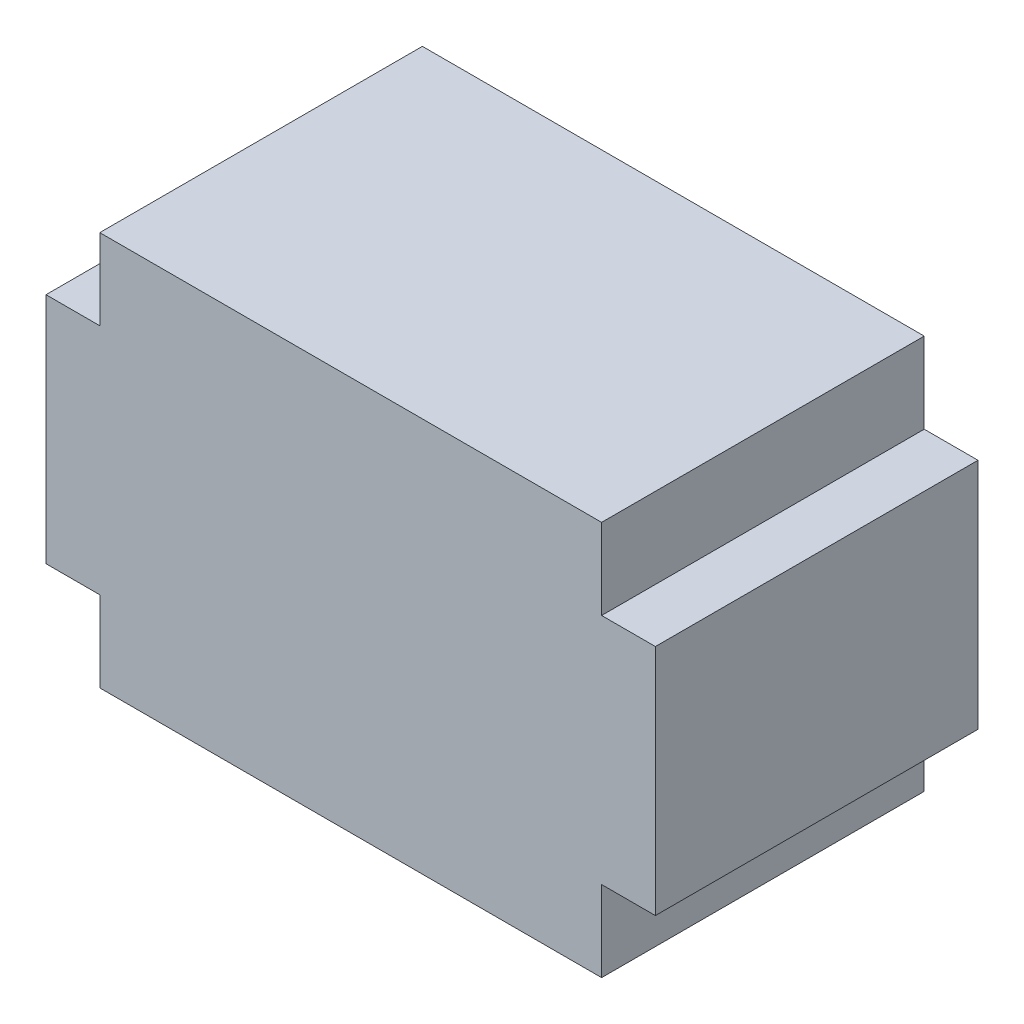
ISO-10303-21;
HEADER;
FILE_DESCRIPTION(('STEP AP214'),'2;1');
FILE_NAME('part.step','',(''),(''),'','','');
FILE_SCHEMA(('AUTOMOTIVE_DESIGN { 1 0 10303 214 1 1 1 1 }'));
ENDSEC;
DATA;
#1=APPLICATION_CONTEXT('core data for automotive mechanical design processes');
#2=APPLICATION_PROTOCOL_DEFINITION('international standard','automotive_design',2000,#1);
#3=PRODUCT_CONTEXT('',#1,'mechanical');
#4=PRODUCT('Part','Part','',(#3));
#5=PRODUCT_RELATED_PRODUCT_CATEGORY('part','',(#4));
#6=PRODUCT_DEFINITION_FORMATION('','',#4);
#7=PRODUCT_DEFINITION_CONTEXT('part definition',#1,'design');
#8=PRODUCT_DEFINITION('design','',#6,#7);
#9=PRODUCT_DEFINITION_SHAPE('','',#8);
#10=(LENGTH_UNIT() NAMED_UNIT(*) SI_UNIT(.MILLI.,.METRE.));
#11=(NAMED_UNIT(*) PLANE_ANGLE_UNIT() SI_UNIT($,.RADIAN.));
#12=(NAMED_UNIT(*) SI_UNIT($,.STERADIAN.) SOLID_ANGLE_UNIT());
#13=UNCERTAINTY_MEASURE_WITH_UNIT(LENGTH_MEASURE(1.E-05),#10,'distance_accuracy_value','');
#14=(GEOMETRIC_REPRESENTATION_CONTEXT(3) GLOBAL_UNCERTAINTY_ASSIGNED_CONTEXT((#13)) GLOBAL_UNIT_ASSIGNED_CONTEXT((#10,
#11,#12)) REPRESENTATION_CONTEXT('',''));
#15=CARTESIAN_POINT('',(0.,0.,0.));
#16=DIRECTION('',(0.,0.,1.));
#17=DIRECTION('',(1.,0.,0.));
#18=AXIS2_PLACEMENT_3D('',#15,#16,#17);
#19=CARTESIAN_POINT('',(1.4,-1.1,1.8));
#20=DIRECTION('',(0.,1.,0.));
#21=DIRECTION('',(0.,0.,1.));
#22=AXIS2_PLACEMENT_3D('',#19,#20,#21);
#23=PLANE('',#22);
#24=DIRECTION('',(1.,0.,0.));
#25=VECTOR('',#24,1.);
#26=CARTESIAN_POINT('',(1.4,-1.1,0.));
#27=LINE('',#26,#25);
#28=CARTESIAN_POINT('',(-1.4,-1.1,0.));
#29=VERTEX_POINT('',#28);
#30=CARTESIAN_POINT('',(1.4,-1.1,0.));
#31=VERTEX_POINT('',#30);
#32=EDGE_CURVE('E98',#29,#31,#27,.T.);
#33=ORIENTED_EDGE('',*,*,#32,.T.);
#34=DIRECTION('',(0.,0.,-1.));
#35=VECTOR('',#34,1.);
#36=CARTESIAN_POINT('',(1.4,-1.1,1.8));
#37=LINE('',#36,#35);
#38=CARTESIAN_POINT('',(1.4,-1.1,1.8));
#39=VERTEX_POINT('',#38);
#40=EDGE_CURVE('E11',#39,#31,#37,.T.);
#41=ORIENTED_EDGE('',*,*,#40,.F.);
#42=DIRECTION('',(1.,0.,0.));
#43=VECTOR('',#42,1.);
#44=CARTESIAN_POINT('',(-1.35,-1.1,1.8));
#45=LINE('',#44,#43);
#46=CARTESIAN_POINT('',(-1.4,-1.1,1.8));
#47=VERTEX_POINT('',#46);
#48=EDGE_CURVE('E104',#47,#39,#45,.T.);
#49=ORIENTED_EDGE('',*,*,#48,.F.);
#50=DIRECTION('',(0.,0.,-1.));
#51=VECTOR('',#50,1.);
#52=CARTESIAN_POINT('',(-1.4,-1.1,1.8));
#53=LINE('',#52,#51);
#54=EDGE_CURVE('E150',#47,#29,#53,.T.);
#55=ORIENTED_EDGE('',*,*,#54,.T.);
#56=EDGE_LOOP('',(#33,#41,#49,#55));
#57=FACE_BOUND('',#56,.T.);
#58=ADVANCED_FACE('F34',(#57),#23,.F.);
#59=CARTESIAN_POINT('',(1.4,-0.65,1.8));
#60=DIRECTION('',(-1.,0.,0.));
#61=DIRECTION('',(0.,0.,1.));
#62=AXIS2_PLACEMENT_3D('',#59,#60,#61);
#63=PLANE('',#62);
#64=DIRECTION('',(0.,1.,0.));
#65=VECTOR('',#64,1.);
#66=CARTESIAN_POINT('',(1.4,-0.65,0.));
#67=LINE('',#66,#65);
#68=CARTESIAN_POINT('',(1.4,-0.65,0.));
#69=VERTEX_POINT('',#68);
#70=EDGE_CURVE('E155',#31,#69,#67,.T.);
#71=ORIENTED_EDGE('',*,*,#70,.T.);
#72=DIRECTION('',(0.,0.,-1.));
#73=VECTOR('',#72,1.);
#74=CARTESIAN_POINT('',(1.4,-0.65,1.8));
#75=LINE('',#74,#73);
#76=CARTESIAN_POINT('',(1.4,-0.65,1.8));
#77=VERTEX_POINT('',#76);
#78=EDGE_CURVE('E42',#77,#69,#75,.T.);
#79=ORIENTED_EDGE('',*,*,#78,.F.);
#80=DIRECTION('',(0.,1.,0.));
#81=VECTOR('',#80,1.);
#82=CARTESIAN_POINT('',(1.4,-0.65,1.8));
#83=LINE('',#82,#81);
#84=EDGE_CURVE('E243',#39,#77,#83,.T.);
#85=ORIENTED_EDGE('',*,*,#84,.F.);
#86=ORIENTED_EDGE('',*,*,#40,.T.);
#87=EDGE_LOOP('',(#71,#79,#85,#86));
#88=FACE_BOUND('',#87,.T.);
#89=ADVANCED_FACE('F246',(#88),#63,.F.);
#90=CARTESIAN_POINT('',(1.7,-0.65,1.8));
#91=DIRECTION('',(0.,1.,0.));
#92=DIRECTION('',(0.,0.,1.));
#93=AXIS2_PLACEMENT_3D('',#90,#91,#92);
#94=PLANE('',#93);
#95=DIRECTION('',(1.,0.,0.));
#96=VECTOR('',#95,1.);
#97=CARTESIAN_POINT('',(1.7,-0.65,0.));
#98=LINE('',#97,#96);
#99=CARTESIAN_POINT('',(1.7,-0.65,0.));
#100=VERTEX_POINT('',#99);
#101=EDGE_CURVE('E157',#69,#100,#98,.T.);
#102=ORIENTED_EDGE('',*,*,#101,.T.);
#103=DIRECTION('',(0.,0.,-1.));
#104=VECTOR('',#103,1.);
#105=CARTESIAN_POINT('',(1.7,-0.65,1.8));
#106=LINE('',#105,#104);
#107=CARTESIAN_POINT('',(1.7,-0.65,1.8));
#108=VERTEX_POINT('',#107);
#109=EDGE_CURVE('E194',#108,#100,#106,.T.);
#110=ORIENTED_EDGE('',*,*,#109,.F.);
#111=DIRECTION('',(1.,0.,0.));
#112=VECTOR('',#111,1.);
#113=CARTESIAN_POINT('',(1.7,-0.65,1.8));
#114=LINE('',#113,#112);
#115=EDGE_CURVE('E203',#77,#108,#114,.T.);
#116=ORIENTED_EDGE('',*,*,#115,.F.);
#117=ORIENTED_EDGE('',*,*,#78,.T.);
#118=EDGE_LOOP('',(#102,#110,#116,#117));
#119=FACE_BOUND('',#118,.T.);
#120=ADVANCED_FACE('F201',(#119),#94,.F.);
#121=CARTESIAN_POINT('',(1.7,0.65,1.8));
#122=DIRECTION('',(-1.,0.,0.));
#123=DIRECTION('',(0.,0.,1.));
#124=AXIS2_PLACEMENT_3D('',#121,#122,#123);
#125=PLANE('',#124);
#126=DIRECTION('',(0.,1.,0.));
#127=VECTOR('',#126,1.);
#128=CARTESIAN_POINT('',(1.7,0.65,0.));
#129=LINE('',#128,#127);
#130=CARTESIAN_POINT('',(1.7,0.65,0.));
#131=VERTEX_POINT('',#130);
#132=EDGE_CURVE('E159',#100,#131,#129,.T.);
#133=ORIENTED_EDGE('',*,*,#132,.T.);
#134=DIRECTION('',(0.,0.,-1.));
#135=VECTOR('',#134,1.);
#136=CARTESIAN_POINT('',(1.7,0.65,1.8));
#137=LINE('',#136,#135);
#138=CARTESIAN_POINT('',(1.7,0.65,1.8));
#139=VERTEX_POINT('',#138);
#140=EDGE_CURVE('E191',#139,#131,#137,.T.);
#141=ORIENTED_EDGE('',*,*,#140,.F.);
#142=DIRECTION('',(0.,1.,0.));
#143=VECTOR('',#142,1.);
#144=CARTESIAN_POINT('',(1.7,0.65,1.8));
#145=LINE('',#144,#143);
#146=EDGE_CURVE('E221',#108,#139,#145,.T.);
#147=ORIENTED_EDGE('',*,*,#146,.F.);
#148=ORIENTED_EDGE('',*,*,#109,.T.);
#149=EDGE_LOOP('',(#133,#141,#147,#148));
#150=FACE_BOUND('',#149,.T.);
#151=ADVANCED_FACE('F212',(#150),#125,.F.);
#152=CARTESIAN_POINT('',(1.4,0.65,1.8));
#153=DIRECTION('',(0.,-1.,0.));
#154=DIRECTION('',(0.,0.,-1.));
#155=AXIS2_PLACEMENT_3D('',#152,#153,#154);
#156=PLANE('',#155);
#157=DIRECTION('',(-1.,0.,0.));
#158=VECTOR('',#157,1.);
#159=CARTESIAN_POINT('',(1.4,0.65,0.));
#160=LINE('',#159,#158);
#161=CARTESIAN_POINT('',(1.4,0.65,0.));
#162=VERTEX_POINT('',#161);
#163=EDGE_CURVE('E161',#131,#162,#160,.T.);
#164=ORIENTED_EDGE('',*,*,#163,.T.);
#165=DIRECTION('',(0.,0.,-1.));
#166=VECTOR('',#165,1.);
#167=CARTESIAN_POINT('',(1.4,0.65,1.8));
#168=LINE('',#167,#166);
#169=CARTESIAN_POINT('',(1.4,0.65,1.8));
#170=VERTEX_POINT('',#169);
#171=EDGE_CURVE('E188',#170,#162,#168,.T.);
#172=ORIENTED_EDGE('',*,*,#171,.F.);
#173=DIRECTION('',(-1.,0.,0.));
#174=VECTOR('',#173,1.);
#175=CARTESIAN_POINT('',(1.4,0.65,1.8));
#176=LINE('',#175,#174);
#177=EDGE_CURVE('E218',#139,#170,#176,.T.);
#178=ORIENTED_EDGE('',*,*,#177,.F.);
#179=ORIENTED_EDGE('',*,*,#140,.T.);
#180=EDGE_LOOP('',(#164,#172,#178,#179));
#181=FACE_BOUND('',#180,.T.);
#182=ADVANCED_FACE('F216',(#181),#156,.F.);
#183=CARTESIAN_POINT('',(1.4,1.1,1.8));
#184=DIRECTION('',(-1.,0.,0.));
#185=DIRECTION('',(0.,0.,1.));
#186=AXIS2_PLACEMENT_3D('',#183,#184,#185);
#187=PLANE('',#186);
#188=DIRECTION('',(0.,1.,0.));
#189=VECTOR('',#188,1.);
#190=CARTESIAN_POINT('',(1.4,1.1,0.));
#191=LINE('',#190,#189);
#192=CARTESIAN_POINT('',(1.4,1.1,0.));
#193=VERTEX_POINT('',#192);
#194=EDGE_CURVE('E163',#162,#193,#191,.T.);
#195=ORIENTED_EDGE('',*,*,#194,.T.);
#196=DIRECTION('',(0.,0.,-1.));
#197=VECTOR('',#196,1.);
#198=CARTESIAN_POINT('',(1.4,1.1,1.8));
#199=LINE('',#198,#197);
#200=CARTESIAN_POINT('',(1.4,1.1,1.8));
#201=VERTEX_POINT('',#200);
#202=EDGE_CURVE('E185',#201,#193,#199,.T.);
#203=ORIENTED_EDGE('',*,*,#202,.F.);
#204=DIRECTION('',(0.,1.,0.));
#205=VECTOR('',#204,1.);
#206=CARTESIAN_POINT('',(1.4,1.1,1.8));
#207=LINE('',#206,#205);
#208=EDGE_CURVE('E220',#170,#201,#207,.T.);
#209=ORIENTED_EDGE('',*,*,#208,.F.);
#210=ORIENTED_EDGE('',*,*,#171,.T.);
#211=EDGE_LOOP('',(#195,#203,#209,#210));
#212=FACE_BOUND('',#211,.T.);
#213=ADVANCED_FACE('F258',(#212),#187,.F.);
#214=CARTESIAN_POINT('',(-1.4,1.1,1.8));
#215=DIRECTION('',(0.,-1.,0.));
#216=DIRECTION('',(0.,0.,-1.));
#217=AXIS2_PLACEMENT_3D('',#214,#215,#216);
#218=PLANE('',#217);
#219=DIRECTION('',(-1.,0.,0.));
#220=VECTOR('',#219,1.);
#221=CARTESIAN_POINT('',(-1.4,1.1,0.));
#222=LINE('',#221,#220);
#223=CARTESIAN_POINT('',(-1.4,1.1,0.));
#224=VERTEX_POINT('',#223);
#225=EDGE_CURVE('E165',#193,#224,#222,.T.);
#226=ORIENTED_EDGE('',*,*,#225,.T.);
#227=DIRECTION('',(0.,0.,-1.));
#228=VECTOR('',#227,1.);
#229=CARTESIAN_POINT('',(-1.4,1.1,1.8));
#230=LINE('',#229,#228);
#231=CARTESIAN_POINT('',(-1.4,1.1,1.8));
#232=VERTEX_POINT('',#231);
#233=EDGE_CURVE('E182',#232,#224,#230,.T.);
#234=ORIENTED_EDGE('',*,*,#233,.F.);
#235=DIRECTION('',(-1.,0.,0.));
#236=VECTOR('',#235,1.);
#237=CARTESIAN_POINT('',(-1.4,1.1,1.8));
#238=LINE('',#237,#236);
#239=EDGE_CURVE('E223',#201,#232,#238,.T.);
#240=ORIENTED_EDGE('',*,*,#239,.F.);
#241=ORIENTED_EDGE('',*,*,#202,.T.);
#242=EDGE_LOOP('',(#226,#234,#240,#241));
#243=FACE_BOUND('',#242,.T.);
#244=ADVANCED_FACE('F261',(#243),#218,.F.);
#245=CARTESIAN_POINT('',(-1.4,0.65,1.8));
#246=DIRECTION('',(1.,0.,0.));
#247=DIRECTION('',(0.,0.,-1.));
#248=AXIS2_PLACEMENT_3D('',#245,#246,#247);
#249=PLANE('',#248);
#250=DIRECTION('',(0.,-1.,0.));
#251=VECTOR('',#250,1.);
#252=CARTESIAN_POINT('',(-1.4,0.65,0.));
#253=LINE('',#252,#251);
#254=CARTESIAN_POINT('',(-1.4,0.65,0.));
#255=VERTEX_POINT('',#254);
#256=EDGE_CURVE('E167',#224,#255,#253,.T.);
#257=ORIENTED_EDGE('',*,*,#256,.T.);
#258=DIRECTION('',(0.,0.,-1.));
#259=VECTOR('',#258,1.);
#260=CARTESIAN_POINT('',(-1.4,0.65,1.8));
#261=LINE('',#260,#259);
#262=CARTESIAN_POINT('',(-1.4,0.65,1.8));
#263=VERTEX_POINT('',#262);
#264=EDGE_CURVE('E179',#263,#255,#261,.T.);
#265=ORIENTED_EDGE('',*,*,#264,.F.);
#266=DIRECTION('',(0.,-1.,0.));
#267=VECTOR('',#266,1.);
#268=CARTESIAN_POINT('',(-1.4,0.65,1.8));
#269=LINE('',#268,#267);
#270=EDGE_CURVE('E229',#232,#263,#269,.T.);
#271=ORIENTED_EDGE('',*,*,#270,.F.);
#272=ORIENTED_EDGE('',*,*,#233,.T.);
#273=EDGE_LOOP('',(#257,#265,#271,#272));
#274=FACE_BOUND('',#273,.T.);
#275=ADVANCED_FACE('F235',(#274),#249,.F.);
#276=CARTESIAN_POINT('',(-1.7,0.65,1.8));
#277=DIRECTION('',(0.,-1.,0.));
#278=DIRECTION('',(0.,0.,-1.));
#279=AXIS2_PLACEMENT_3D('',#276,#277,#278);
#280=PLANE('',#279);
#281=DIRECTION('',(-1.,0.,0.));
#282=VECTOR('',#281,1.);
#283=CARTESIAN_POINT('',(-1.7,0.65,0.));
#284=LINE('',#283,#282);
#285=CARTESIAN_POINT('',(-1.7,0.65,0.));
#286=VERTEX_POINT('',#285);
#287=EDGE_CURVE('E169',#255,#286,#284,.T.);
#288=ORIENTED_EDGE('',*,*,#287,.T.);
#289=DIRECTION('',(0.,0.,-1.));
#290=VECTOR('',#289,1.);
#291=CARTESIAN_POINT('',(-1.7,0.65,1.8));
#292=LINE('',#291,#290);
#293=CARTESIAN_POINT('',(-1.7,0.65,1.8));
#294=VERTEX_POINT('',#293);
#295=EDGE_CURVE('E145',#294,#286,#292,.T.);
#296=ORIENTED_EDGE('',*,*,#295,.F.);
#297=DIRECTION('',(-1.,0.,0.));
#298=VECTOR('',#297,1.);
#299=CARTESIAN_POINT('',(-1.7,0.65,1.8));
#300=LINE('',#299,#298);
#301=EDGE_CURVE('E136',#263,#294,#300,.T.);
#302=ORIENTED_EDGE('',*,*,#301,.F.);
#303=ORIENTED_EDGE('',*,*,#264,.T.);
#304=EDGE_LOOP('',(#288,#296,#302,#303));
#305=FACE_BOUND('',#304,.T.);
#306=ADVANCED_FACE('F239',(#305),#280,.F.);
#307=CARTESIAN_POINT('',(-1.7,-0.65,1.8));
#308=DIRECTION('',(1.,0.,0.));
#309=DIRECTION('',(0.,0.,-1.));
#310=AXIS2_PLACEMENT_3D('',#307,#308,#309);
#311=PLANE('',#310);
#312=DIRECTION('',(0.,-1.,0.));
#313=VECTOR('',#312,1.);
#314=CARTESIAN_POINT('',(-1.7,-0.65,0.));
#315=LINE('',#314,#313);
#316=CARTESIAN_POINT('',(-1.7,-0.65,0.));
#317=VERTEX_POINT('',#316);
#318=EDGE_CURVE('E144',#286,#317,#315,.T.);
#319=ORIENTED_EDGE('',*,*,#318,.T.);
#320=DIRECTION('',(0.,0.,-1.));
#321=VECTOR('',#320,1.);
#322=CARTESIAN_POINT('',(-1.7,-0.65,1.8));
#323=LINE('',#322,#321);
#324=CARTESIAN_POINT('',(-1.7,-0.65,1.8));
#325=VERTEX_POINT('',#324);
#326=EDGE_CURVE('E141',#325,#317,#323,.T.);
#327=ORIENTED_EDGE('',*,*,#326,.F.);
#328=DIRECTION('',(0.,-1.,0.));
#329=VECTOR('',#328,1.);
#330=CARTESIAN_POINT('',(-1.7,-0.65,1.8));
#331=LINE('',#330,#329);
#332=EDGE_CURVE('E130',#294,#325,#331,.T.);
#333=ORIENTED_EDGE('',*,*,#332,.F.);
#334=ORIENTED_EDGE('',*,*,#295,.T.);
#335=EDGE_LOOP('',(#319,#327,#333,#334));
#336=FACE_BOUND('',#335,.T.);
#337=ADVANCED_FACE('F142',(#336),#311,.F.);
#338=CARTESIAN_POINT('',(-1.4,-0.65,1.8));
#339=DIRECTION('',(0.,1.,0.));
#340=DIRECTION('',(0.,0.,1.));
#341=AXIS2_PLACEMENT_3D('',#338,#339,#340);
#342=PLANE('',#341);
#343=DIRECTION('',(1.,0.,0.));
#344=VECTOR('',#343,1.);
#345=CARTESIAN_POINT('',(-1.4,-0.65,0.));
#346=LINE('',#345,#344);
#347=CARTESIAN_POINT('',(-1.4,-0.65,0.));
#348=VERTEX_POINT('',#347);
#349=EDGE_CURVE('E91',#317,#348,#346,.T.);
#350=ORIENTED_EDGE('',*,*,#349,.T.);
#351=DIRECTION('',(0.,0.,-1.));
#352=VECTOR('',#351,1.);
#353=CARTESIAN_POINT('',(-1.4,-0.65,1.8));
#354=LINE('',#353,#352);
#355=CARTESIAN_POINT('',(-1.4,-0.65,1.8));
#356=VERTEX_POINT('',#355);
#357=EDGE_CURVE('E146',#356,#348,#354,.T.);
#358=ORIENTED_EDGE('',*,*,#357,.F.);
#359=DIRECTION('',(1.,0.,0.));
#360=VECTOR('',#359,1.);
#361=CARTESIAN_POINT('',(-1.4,-0.65,1.8));
#362=LINE('',#361,#360);
#363=EDGE_CURVE('E134',#325,#356,#362,.T.);
#364=ORIENTED_EDGE('',*,*,#363,.F.);
#365=ORIENTED_EDGE('',*,*,#326,.T.);
#366=EDGE_LOOP('',(#350,#358,#364,#365));
#367=FACE_BOUND('',#366,.T.);
#368=ADVANCED_FACE('F148',(#367),#342,.F.);
#369=CARTESIAN_POINT('',(-1.4,-1.1,1.8));
#370=DIRECTION('',(1.,0.,0.));
#371=DIRECTION('',(0.,0.,-1.));
#372=AXIS2_PLACEMENT_3D('',#369,#370,#371);
#373=PLANE('',#372);
#374=DIRECTION('',(0.,-1.,0.));
#375=VECTOR('',#374,1.);
#376=CARTESIAN_POINT('',(-1.4,-1.1,0.));
#377=LINE('',#376,#375);
#378=EDGE_CURVE('E173',#348,#29,#377,.T.);
#379=ORIENTED_EDGE('',*,*,#378,.T.);
#380=ORIENTED_EDGE('',*,*,#54,.F.);
#381=DIRECTION('',(0.,-1.,0.));
#382=VECTOR('',#381,1.);
#383=CARTESIAN_POINT('',(-1.4,-1.1,1.8));
#384=LINE('',#383,#382);
#385=EDGE_CURVE('E50',#356,#47,#384,.T.);
#386=ORIENTED_EDGE('',*,*,#385,.F.);
#387=ORIENTED_EDGE('',*,*,#357,.T.);
#388=EDGE_LOOP('',(#379,#380,#386,#387));
#389=FACE_BOUND('',#388,.T.);
#390=ADVANCED_FACE('F241',(#389),#373,.F.);
#391=CARTESIAN_POINT('',(0.,0.,1.8));
#392=DIRECTION('',(0.,0.,-1.));
#393=DIRECTION('',(-1.,0.,0.));
#394=AXIS2_PLACEMENT_3D('',#391,#392,#393);
#395=PLANE('',#394);
#396=ORIENTED_EDGE('',*,*,#48,.T.);
#397=ORIENTED_EDGE('',*,*,#84,.T.);
#398=ORIENTED_EDGE('',*,*,#115,.T.);
#399=ORIENTED_EDGE('',*,*,#146,.T.);
#400=ORIENTED_EDGE('',*,*,#177,.T.);
#401=ORIENTED_EDGE('',*,*,#208,.T.);
#402=ORIENTED_EDGE('',*,*,#239,.T.);
#403=ORIENTED_EDGE('',*,*,#270,.T.);
#404=ORIENTED_EDGE('',*,*,#301,.T.);
#405=ORIENTED_EDGE('',*,*,#332,.T.);
#406=ORIENTED_EDGE('',*,*,#363,.T.);
#407=ORIENTED_EDGE('',*,*,#385,.T.);
#408=EDGE_LOOP('',(#396,#397,#398,#399,#400,#401,#402,#403,#404,#405,#406,#407));
#409=FACE_BOUND('',#408,.T.);
#410=ADVANCED_FACE('F132',(#409),#395,.F.);
#411=CARTESIAN_POINT('',(0.,0.,0.));
#412=DIRECTION('',(0.,0.,-1.));
#413=DIRECTION('',(-1.,0.,0.));
#414=AXIS2_PLACEMENT_3D('',#411,#412,#413);
#415=PLANE('',#414);
#416=ORIENTED_EDGE('',*,*,#32,.F.);
#417=ORIENTED_EDGE('',*,*,#378,.F.);
#418=ORIENTED_EDGE('',*,*,#349,.F.);
#419=ORIENTED_EDGE('',*,*,#318,.F.);
#420=ORIENTED_EDGE('',*,*,#287,.F.);
#421=ORIENTED_EDGE('',*,*,#256,.F.);
#422=ORIENTED_EDGE('',*,*,#225,.F.);
#423=ORIENTED_EDGE('',*,*,#194,.F.);
#424=ORIENTED_EDGE('',*,*,#163,.F.);
#425=ORIENTED_EDGE('',*,*,#132,.F.);
#426=ORIENTED_EDGE('',*,*,#101,.F.);
#427=ORIENTED_EDGE('',*,*,#70,.F.);
#428=EDGE_LOOP('',(#416,#417,#418,#419,#420,#421,#422,#423,#424,#425,#426,#427));
#429=FACE_BOUND('',#428,.T.);
#430=ADVANCED_FACE('F207',(#429),#415,.T.);
#431=CLOSED_SHELL('',(#58,#89,#120,#151,#182,#213,#244,#275,#306,#337,#368,#390,#410,#430));
#432=MANIFOLD_SOLID_BREP('B2',#431);
#433=ADVANCED_BREP_SHAPE_REPRESENTATION('',(#18,#432),#14);
#434=SHAPE_DEFINITION_REPRESENTATION(#9,#433);
ENDSEC;
END-ISO-10303-21;
